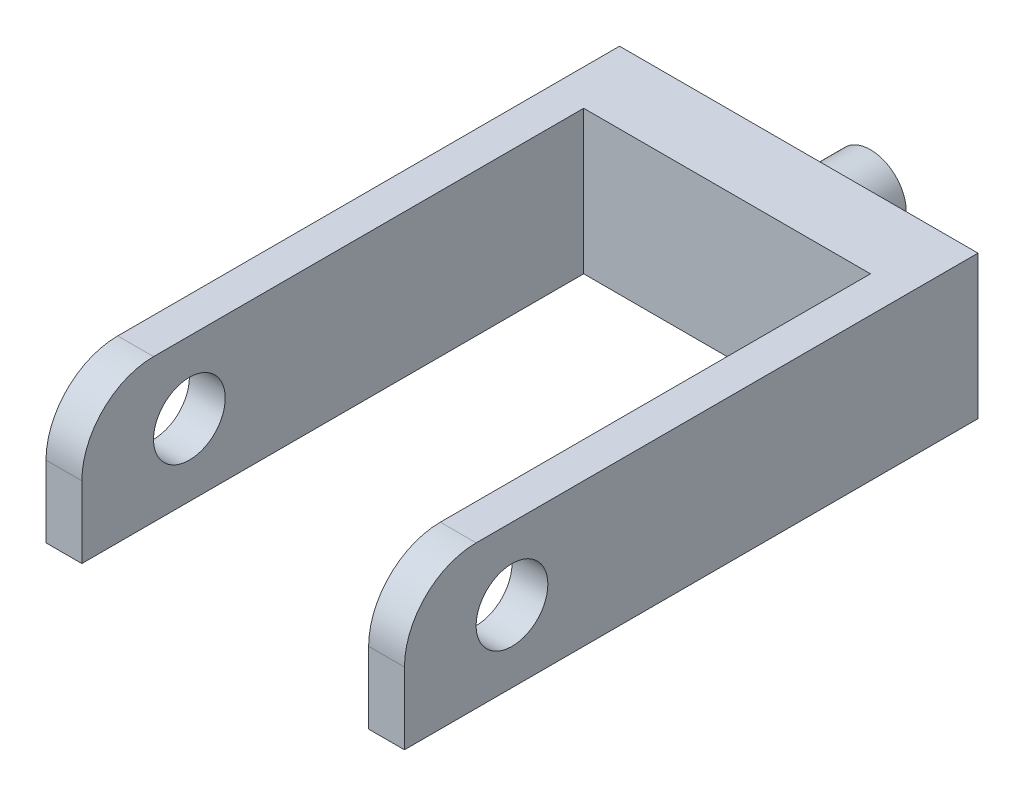
ISO-10303-21;
HEADER;
FILE_DESCRIPTION(('STEP AP214'),'2;1');
FILE_NAME('part.step','',(''),(''),'','','');
FILE_SCHEMA(('AUTOMOTIVE_DESIGN { 1 0 10303 214 1 1 1 1 }'));
ENDSEC;
DATA;
#1=APPLICATION_CONTEXT('core data for automotive mechanical design processes');
#2=APPLICATION_PROTOCOL_DEFINITION('international standard','automotive_design',2000,#1);
#3=PRODUCT_CONTEXT('',#1,'mechanical');
#4=PRODUCT('Part','Part','',(#3));
#5=PRODUCT_RELATED_PRODUCT_CATEGORY('part','',(#4));
#6=PRODUCT_DEFINITION_FORMATION('','',#4);
#7=PRODUCT_DEFINITION_CONTEXT('part definition',#1,'design');
#8=PRODUCT_DEFINITION('design','',#6,#7);
#9=PRODUCT_DEFINITION_SHAPE('','',#8);
#10=(LENGTH_UNIT() NAMED_UNIT(*) SI_UNIT(.MILLI.,.METRE.));
#11=(NAMED_UNIT(*) PLANE_ANGLE_UNIT() SI_UNIT($,.RADIAN.));
#12=(NAMED_UNIT(*) SI_UNIT($,.STERADIAN.) SOLID_ANGLE_UNIT());
#13=UNCERTAINTY_MEASURE_WITH_UNIT(LENGTH_MEASURE(1.E-05),#10,'distance_accuracy_value','');
#14=(GEOMETRIC_REPRESENTATION_CONTEXT(3) GLOBAL_UNCERTAINTY_ASSIGNED_CONTEXT((#13)) GLOBAL_UNIT_ASSIGNED_CONTEXT((#10,
#11,#12)) REPRESENTATION_CONTEXT('',''));
#15=CARTESIAN_POINT('',(0.,0.,0.));
#16=DIRECTION('',(0.,0.,1.));
#17=DIRECTION('',(1.,0.,0.));
#18=AXIS2_PLACEMENT_3D('',#15,#16,#17);
#19=CARTESIAN_POINT('',(0.,50.8,203.2));
#20=DIRECTION('',(0.,0.,-1.));
#21=DIRECTION('',(-1.,0.,0.));
#22=AXIS2_PLACEMENT_3D('',#19,#20,#21);
#23=PLANE('',#22);
#24=DIRECTION('',(0.,-1.,0.));
#25=VECTOR('',#24,1.);
#26=CARTESIAN_POINT('',(0.,50.8,203.2));
#27=LINE('',#26,#25);
#28=CARTESIAN_POINT('',(0.,25.4,203.2));
#29=VERTEX_POINT('',#28);
#30=CARTESIAN_POINT('',(0.,0.,203.2));
#31=VERTEX_POINT('',#30);
#32=EDGE_CURVE('E159',#29,#31,#27,.T.);
#33=ORIENTED_EDGE('',*,*,#32,.F.);
#34=DIRECTION('',(1.,0.,0.));
#35=VECTOR('',#34,1.);
#36=CARTESIAN_POINT('',(0.,25.4,203.2));
#37=LINE('',#36,#35);
#38=CARTESIAN_POINT('',(-12.7,25.4,203.2));
#39=VERTEX_POINT('',#38);
#40=EDGE_CURVE('E44',#29,#39,#37,.F.);
#41=ORIENTED_EDGE('',*,*,#40,.T.);
#42=DIRECTION('',(0.,1.,0.));
#43=VECTOR('',#42,1.);
#44=CARTESIAN_POINT('',(-12.7,-203.2,203.2));
#45=LINE('',#44,#43);
#46=CARTESIAN_POINT('',(-12.7,0.,203.2));
#47=VERTEX_POINT('',#46);
#48=EDGE_CURVE('E148',#47,#39,#45,.T.);
#49=ORIENTED_EDGE('',*,*,#48,.F.);
#50=DIRECTION('',(1.,0.,0.));
#51=VECTOR('',#50,1.);
#52=CARTESIAN_POINT('',(0.,0.,203.2));
#53=LINE('',#52,#51);
#54=EDGE_CURVE('E167',#47,#31,#53,.T.);
#55=ORIENTED_EDGE('',*,*,#54,.T.);
#56=EDGE_LOOP('',(#33,#41,#49,#55));
#57=FACE_BOUND('',#56,.T.);
#58=ADVANCED_FACE('F36',(#57),#23,.F.);
#59=CARTESIAN_POINT('',(0.,50.8,0.));
#60=DIRECTION('',(-1.,0.,0.));
#61=DIRECTION('',(0.,0.,1.));
#62=AXIS2_PLACEMENT_3D('',#59,#60,#61);
#63=PLANE('',#62);
#64=CARTESIAN_POINT('',(0.,25.4,165.1));
#65=DIRECTION('',(1.,0.,0.));
#66=DIRECTION('',(0.,0.,-1.));
#67=AXIS2_PLACEMENT_3D('',#64,#65,#66);
#68=CIRCLE('',#67,12.7);
#69=CARTESIAN_POINT('',(0.,25.4,152.4));
#70=VERTEX_POINT('',#69);
#71=EDGE_CURVE('E188',#70,#70,#68,.T.);
#72=ORIENTED_EDGE('',*,*,#71,.F.);
#73=EDGE_LOOP('',(#72));
#74=FACE_BOUND('',#73,.T.);
#75=DIRECTION('',(0.,0.,-1.));
#76=VECTOR('',#75,1.);
#77=CARTESIAN_POINT('',(0.,50.8,0.));
#78=LINE('',#77,#76);
#79=CARTESIAN_POINT('',(0.,50.8,177.8));
#80=VERTEX_POINT('',#79);
#81=CARTESIAN_POINT('',(0.,50.8,0.));
#82=VERTEX_POINT('',#81);
#83=EDGE_CURVE('E152',#80,#82,#78,.T.);
#84=ORIENTED_EDGE('',*,*,#83,.F.);
#85=CARTESIAN_POINT('',(0.,25.4,177.8));
#86=DIRECTION('',(-1.,0.,0.));
#87=DIRECTION('',(0.,0.,1.));
#88=AXIS2_PLACEMENT_3D('',#85,#86,#87);
#89=CIRCLE('',#88,25.4);
#90=EDGE_CURVE('E58',#80,#29,#89,.F.);
#91=ORIENTED_EDGE('',*,*,#90,.T.);
#92=ORIENTED_EDGE('',*,*,#32,.T.);
#93=DIRECTION('',(0.,0.,-1.));
#94=VECTOR('',#93,1.);
#95=CARTESIAN_POINT('',(0.,0.,0.));
#96=LINE('',#95,#94);
#97=CARTESIAN_POINT('',(0.,0.,0.));
#98=VERTEX_POINT('',#97);
#99=EDGE_CURVE('E147',#31,#98,#96,.T.);
#100=ORIENTED_EDGE('',*,*,#99,.T.);
#101=DIRECTION('',(0.,-1.,0.));
#102=VECTOR('',#101,1.);
#103=CARTESIAN_POINT('',(0.,50.8,0.));
#104=LINE('',#103,#102);
#105=EDGE_CURVE('E176',#82,#98,#104,.T.);
#106=ORIENTED_EDGE('',*,*,#105,.F.);
#107=EDGE_LOOP('',(#84,#91,#92,#100,#106));
#108=FACE_BOUND('',#107,.T.);
#109=ADVANCED_FACE('F204',(#74,#108),#63,.F.);
#110=CARTESIAN_POINT('',(0.,50.8,0.));
#111=DIRECTION('',(0.,0.,1.));
#112=DIRECTION('',(1.,0.,0.));
#113=AXIS2_PLACEMENT_3D('',#110,#111,#112);
#114=PLANE('',#113);
#115=CARTESIAN_POINT('',(-63.5,25.4,0.));
#116=DIRECTION('',(0.,0.,-1.));
#117=DIRECTION('',(-1.,0.,0.));
#118=AXIS2_PLACEMENT_3D('',#115,#116,#117);
#119=CIRCLE('',#118,12.7);
#120=CARTESIAN_POINT('',(-76.2,25.4,0.));
#121=VERTEX_POINT('',#120);
#122=EDGE_CURVE('E184',#121,#121,#119,.T.);
#123=ORIENTED_EDGE('',*,*,#122,.F.);
#124=EDGE_LOOP('',(#123));
#125=FACE_BOUND('',#124,.T.);
#126=DIRECTION('',(-1.,0.,0.));
#127=VECTOR('',#126,1.);
#128=CARTESIAN_POINT('',(0.,0.,0.));
#129=LINE('',#128,#127);
#130=CARTESIAN_POINT('',(-127.,0.,0.));
#131=VERTEX_POINT('',#130);
#132=EDGE_CURVE('E162',#98,#131,#129,.T.);
#133=ORIENTED_EDGE('',*,*,#132,.T.);
#134=DIRECTION('',(0.,-1.,0.));
#135=VECTOR('',#134,1.);
#136=CARTESIAN_POINT('',(-127.,50.8,0.));
#137=LINE('',#136,#135);
#138=CARTESIAN_POINT('',(-127.,50.8,0.));
#139=VERTEX_POINT('',#138);
#140=EDGE_CURVE('E173',#139,#131,#137,.T.);
#141=ORIENTED_EDGE('',*,*,#140,.F.);
#142=DIRECTION('',(-1.,0.,0.));
#143=VECTOR('',#142,1.);
#144=CARTESIAN_POINT('',(0.,50.8,0.));
#145=LINE('',#144,#143);
#146=EDGE_CURVE('E154',#82,#139,#145,.T.);
#147=ORIENTED_EDGE('',*,*,#146,.F.);
#148=ORIENTED_EDGE('',*,*,#105,.T.);
#149=EDGE_LOOP('',(#133,#141,#147,#148));
#150=FACE_BOUND('',#149,.T.);
#151=ADVANCED_FACE('F207',(#125,#150),#114,.F.);
#152=CARTESIAN_POINT('',(-127.,50.8,0.));
#153=DIRECTION('',(1.,0.,0.));
#154=DIRECTION('',(0.,0.,-1.));
#155=AXIS2_PLACEMENT_3D('',#152,#153,#154);
#156=PLANE('',#155);
#157=CARTESIAN_POINT('',(-127.,25.4,165.1));
#158=DIRECTION('',(1.,0.,0.));
#159=DIRECTION('',(0.,0.,-1.));
#160=AXIS2_PLACEMENT_3D('',#157,#158,#159);
#161=CIRCLE('',#160,12.7);
#162=CARTESIAN_POINT('',(-127.,25.4,152.4));
#163=VERTEX_POINT('',#162);
#164=EDGE_CURVE('E138',#163,#163,#161,.T.);
#165=ORIENTED_EDGE('',*,*,#164,.T.);
#166=EDGE_LOOP('',(#165));
#167=FACE_BOUND('',#166,.T.);
#168=DIRECTION('',(0.,-1.,0.));
#169=VECTOR('',#168,1.);
#170=CARTESIAN_POINT('',(-127.,50.8,203.2));
#171=LINE('',#170,#169);
#172=CARTESIAN_POINT('',(-127.,25.4,203.2));
#173=VERTEX_POINT('',#172);
#174=CARTESIAN_POINT('',(-127.,0.,203.2));
#175=VERTEX_POINT('',#174);
#176=EDGE_CURVE('E171',#173,#175,#171,.T.);
#177=ORIENTED_EDGE('',*,*,#176,.F.);
#178=CARTESIAN_POINT('',(-127.,25.4,177.8));
#179=DIRECTION('',(1.,0.,0.));
#180=DIRECTION('',(0.,0.,-1.));
#181=AXIS2_PLACEMENT_3D('',#178,#179,#180);
#182=CIRCLE('',#181,25.4);
#183=CARTESIAN_POINT('',(-127.,50.8,177.8));
#184=VERTEX_POINT('',#183);
#185=EDGE_CURVE('E194',#173,#184,#182,.F.);
#186=ORIENTED_EDGE('',*,*,#185,.T.);
#187=DIRECTION('',(0.,0.,1.));
#188=VECTOR('',#187,1.);
#189=CARTESIAN_POINT('',(-127.,50.8,0.));
#190=LINE('',#189,#188);
#191=EDGE_CURVE('E157',#139,#184,#190,.T.);
#192=ORIENTED_EDGE('',*,*,#191,.F.);
#193=ORIENTED_EDGE('',*,*,#140,.T.);
#194=DIRECTION('',(0.,0.,1.));
#195=VECTOR('',#194,1.);
#196=CARTESIAN_POINT('',(-127.,0.,0.));
#197=LINE('',#196,#195);
#198=EDGE_CURVE('E164',#131,#175,#197,.T.);
#199=ORIENTED_EDGE('',*,*,#198,.T.);
#200=EDGE_LOOP('',(#177,#186,#192,#193,#199));
#201=FACE_BOUND('',#200,.T.);
#202=ADVANCED_FACE('F241',(#167,#201),#156,.F.);
#203=DIRECTION('',(0.,1.,0.));
#204=VECTOR('',#203,1.);
#205=CARTESIAN_POINT('',(-114.3,-203.2,203.2));
#206=LINE('',#205,#204);
#207=CARTESIAN_POINT('',(-114.3,0.,203.2));
#208=VERTEX_POINT('',#207);
#209=CARTESIAN_POINT('',(-114.3,25.4,203.2));
#210=VERTEX_POINT('',#209);
#211=EDGE_CURVE('E121',#208,#210,#206,.T.);
#212=ORIENTED_EDGE('',*,*,#211,.T.);
#213=DIRECTION('',(1.,0.,0.));
#214=VECTOR('',#213,1.);
#215=CARTESIAN_POINT('',(0.,25.4,203.2));
#216=LINE('',#215,#214);
#217=EDGE_CURVE('E192',#210,#173,#216,.F.);
#218=ORIENTED_EDGE('',*,*,#217,.T.);
#219=ORIENTED_EDGE('',*,*,#176,.T.);
#220=EDGE_CURVE('E155',#175,#208,#53,.T.);
#221=ORIENTED_EDGE('',*,*,#220,.T.);
#222=EDGE_LOOP('',(#212,#218,#219,#221));
#223=FACE_BOUND('',#222,.T.);
#224=ADVANCED_FACE('F216',(#223),#23,.F.);
#225=CARTESIAN_POINT('',(0.,50.8,0.));
#226=DIRECTION('',(0.,-1.,0.));
#227=DIRECTION('',(0.,0.,-1.));
#228=AXIS2_PLACEMENT_3D('',#225,#226,#227);
#229=PLANE('',#228);
#230=DIRECTION('',(0.,0.,-1.));
#231=VECTOR('',#230,1.);
#232=CARTESIAN_POINT('',(-12.7,50.8,25.4));
#233=LINE('',#232,#231);
#234=CARTESIAN_POINT('',(-12.7,50.8,177.8));
#235=VERTEX_POINT('',#234);
#236=CARTESIAN_POINT('',(-12.7,50.8,25.4));
#237=VERTEX_POINT('',#236);
#238=EDGE_CURVE('E131',#235,#237,#233,.T.);
#239=ORIENTED_EDGE('',*,*,#238,.F.);
#240=DIRECTION('',(1.,0.,0.));
#241=VECTOR('',#240,1.);
#242=CARTESIAN_POINT('',(0.,50.8,177.8));
#243=LINE('',#242,#241);
#244=EDGE_CURVE('E196',#235,#80,#243,.T.);
#245=ORIENTED_EDGE('',*,*,#244,.T.);
#246=ORIENTED_EDGE('',*,*,#83,.T.);
#247=ORIENTED_EDGE('',*,*,#146,.T.);
#248=ORIENTED_EDGE('',*,*,#191,.T.);
#249=DIRECTION('',(1.,0.,0.));
#250=VECTOR('',#249,1.);
#251=CARTESIAN_POINT('',(0.,50.8,177.8));
#252=LINE('',#251,#250);
#253=CARTESIAN_POINT('',(-114.3,50.8,177.8));
#254=VERTEX_POINT('',#253);
#255=EDGE_CURVE('E137',#184,#254,#252,.T.);
#256=ORIENTED_EDGE('',*,*,#255,.T.);
#257=DIRECTION('',(0.,0.,1.));
#258=VECTOR('',#257,1.);
#259=CARTESIAN_POINT('',(-114.3,50.8,25.4));
#260=LINE('',#259,#258);
#261=CARTESIAN_POINT('',(-114.3,50.8,25.4));
#262=VERTEX_POINT('',#261);
#263=EDGE_CURVE('E116',#262,#254,#260,.T.);
#264=ORIENTED_EDGE('',*,*,#263,.F.);
#265=DIRECTION('',(-1.,0.,0.));
#266=VECTOR('',#265,1.);
#267=CARTESIAN_POINT('',(-63.5,50.8,25.4));
#268=LINE('',#267,#266);
#269=EDGE_CURVE('E122',#237,#262,#268,.T.);
#270=ORIENTED_EDGE('',*,*,#269,.F.);
#271=EDGE_LOOP('',(#239,#245,#246,#247,#248,#256,#264,#270));
#272=FACE_BOUND('',#271,.T.);
#273=ADVANCED_FACE('F134',(#272),#229,.F.);
#274=CARTESIAN_POINT('',(0.,0.,0.));
#275=DIRECTION('',(0.,-1.,0.));
#276=DIRECTION('',(0.,0.,-1.));
#277=AXIS2_PLACEMENT_3D('',#274,#275,#276);
#278=PLANE('',#277);
#279=DIRECTION('',(0.,0.,1.));
#280=VECTOR('',#279,1.);
#281=CARTESIAN_POINT('',(-12.7,0.,0.));
#282=LINE('',#281,#280);
#283=CARTESIAN_POINT('',(-12.7,0.,25.4));
#284=VERTEX_POINT('',#283);
#285=EDGE_CURVE('E182',#284,#47,#282,.T.);
#286=ORIENTED_EDGE('',*,*,#285,.F.);
#287=DIRECTION('',(1.,0.,0.));
#288=VECTOR('',#287,1.);
#289=CARTESIAN_POINT('',(0.,0.,25.4));
#290=LINE('',#289,#288);
#291=CARTESIAN_POINT('',(-114.3,0.,25.4));
#292=VERTEX_POINT('',#291);
#293=EDGE_CURVE('E180',#292,#284,#290,.T.);
#294=ORIENTED_EDGE('',*,*,#293,.F.);
#295=DIRECTION('',(0.,0.,-1.));
#296=VECTOR('',#295,1.);
#297=CARTESIAN_POINT('',(-114.3,0.,0.));
#298=LINE('',#297,#296);
#299=EDGE_CURVE('E118',#208,#292,#298,.T.);
#300=ORIENTED_EDGE('',*,*,#299,.F.);
#301=ORIENTED_EDGE('',*,*,#220,.F.);
#302=ORIENTED_EDGE('',*,*,#198,.F.);
#303=ORIENTED_EDGE('',*,*,#132,.F.);
#304=ORIENTED_EDGE('',*,*,#99,.F.);
#305=ORIENTED_EDGE('',*,*,#54,.F.);
#306=EDGE_LOOP('',(#286,#294,#300,#301,#302,#303,#304,#305));
#307=FACE_BOUND('',#306,.T.);
#308=ADVANCED_FACE('F222',(#307),#278,.T.);
#309=CARTESIAN_POINT('',(-63.5,-203.2,25.4));
#310=DIRECTION('',(0.,0.,-1.));
#311=DIRECTION('',(-1.,0.,0.));
#312=AXIS2_PLACEMENT_3D('',#309,#310,#311);
#313=PLANE('',#312);
#314=ORIENTED_EDGE('',*,*,#293,.T.);
#315=DIRECTION('',(0.,1.,0.));
#316=VECTOR('',#315,1.);
#317=CARTESIAN_POINT('',(-12.7,-203.2,25.4));
#318=LINE('',#317,#316);
#319=EDGE_CURVE('E128',#284,#237,#318,.T.);
#320=ORIENTED_EDGE('',*,*,#319,.T.);
#321=ORIENTED_EDGE('',*,*,#269,.T.);
#322=DIRECTION('',(0.,1.,0.));
#323=VECTOR('',#322,1.);
#324=CARTESIAN_POINT('',(-114.3,-203.2,25.4));
#325=LINE('',#324,#323);
#326=EDGE_CURVE('E112',#292,#262,#325,.T.);
#327=ORIENTED_EDGE('',*,*,#326,.F.);
#328=EDGE_LOOP('',(#314,#320,#321,#327));
#329=FACE_BOUND('',#328,.T.);
#330=ADVANCED_FACE('F126',(#329),#313,.F.);
#331=CARTESIAN_POINT('',(-12.7,-203.2,25.4));
#332=DIRECTION('',(1.,0.,0.));
#333=DIRECTION('',(0.,0.,-1.));
#334=AXIS2_PLACEMENT_3D('',#331,#332,#333);
#335=PLANE('',#334);
#336=CARTESIAN_POINT('',(-12.7,25.4,165.1));
#337=DIRECTION('',(1.,0.,0.));
#338=DIRECTION('',(0.,0.,-1.));
#339=AXIS2_PLACEMENT_3D('',#336,#337,#338);
#340=CIRCLE('',#339,12.7);
#341=CARTESIAN_POINT('',(-12.7,25.4,152.4));
#342=VERTEX_POINT('',#341);
#343=EDGE_CURVE('E142',#342,#342,#340,.T.);
#344=ORIENTED_EDGE('',*,*,#343,.T.);
#345=EDGE_LOOP('',(#344));
#346=FACE_BOUND('',#345,.T.);
#347=ORIENTED_EDGE('',*,*,#48,.T.);
#348=CARTESIAN_POINT('',(-12.7,25.4,177.8));
#349=DIRECTION('',(1.,0.,0.));
#350=DIRECTION('',(0.,0.,-1.));
#351=AXIS2_PLACEMENT_3D('',#348,#349,#350);
#352=CIRCLE('',#351,25.4);
#353=EDGE_CURVE('E11',#39,#235,#352,.F.);
#354=ORIENTED_EDGE('',*,*,#353,.T.);
#355=ORIENTED_EDGE('',*,*,#238,.T.);
#356=ORIENTED_EDGE('',*,*,#319,.F.);
#357=ORIENTED_EDGE('',*,*,#285,.T.);
#358=EDGE_LOOP('',(#347,#354,#355,#356,#357));
#359=FACE_BOUND('',#358,.T.);
#360=ADVANCED_FACE('F225',(#346,#359),#335,.F.);
#361=CARTESIAN_POINT('',(-114.3,-203.2,25.4));
#362=DIRECTION('',(-1.,0.,0.));
#363=DIRECTION('',(0.,0.,1.));
#364=AXIS2_PLACEMENT_3D('',#361,#362,#363);
#365=PLANE('',#364);
#366=CARTESIAN_POINT('',(-114.3,25.4,165.1));
#367=DIRECTION('',(-1.,0.,0.));
#368=DIRECTION('',(0.,0.,1.));
#369=AXIS2_PLACEMENT_3D('',#366,#367,#368);
#370=CIRCLE('',#369,12.7);
#371=CARTESIAN_POINT('',(-114.3,25.4,177.8));
#372=VERTEX_POINT('',#371);
#373=EDGE_CURVE('E185',#372,#372,#370,.T.);
#374=ORIENTED_EDGE('',*,*,#373,.T.);
#375=EDGE_LOOP('',(#374));
#376=FACE_BOUND('',#375,.T.);
#377=ORIENTED_EDGE('',*,*,#263,.T.);
#378=CARTESIAN_POINT('',(-114.3,25.4,177.8));
#379=DIRECTION('',(-1.,0.,0.));
#380=DIRECTION('',(0.,0.,1.));
#381=AXIS2_PLACEMENT_3D('',#378,#379,#380);
#382=CIRCLE('',#381,25.4);
#383=EDGE_CURVE('E190',#254,#210,#382,.F.);
#384=ORIENTED_EDGE('',*,*,#383,.T.);
#385=ORIENTED_EDGE('',*,*,#211,.F.);
#386=ORIENTED_EDGE('',*,*,#299,.T.);
#387=ORIENTED_EDGE('',*,*,#326,.T.);
#388=EDGE_LOOP('',(#377,#384,#385,#386,#387));
#389=FACE_BOUND('',#388,.T.);
#390=ADVANCED_FACE('F114',(#376,#389),#365,.F.);
#391=CARTESIAN_POINT('',(-254.,25.4,165.1));
#392=DIRECTION('',(1.,0.,0.));
#393=DIRECTION('',(0.,0.,-1.));
#394=AXIS2_PLACEMENT_3D('',#391,#392,#393);
#395=CYLINDRICAL_SURFACE('',#394,12.7);
#396=ORIENTED_EDGE('',*,*,#373,.F.);
#397=EDGE_LOOP('',(#396));
#398=FACE_BOUND('',#397,.T.);
#399=ORIENTED_EDGE('',*,*,#164,.F.);
#400=EDGE_LOOP('',(#399));
#401=FACE_BOUND('',#400,.T.);
#402=ADVANCED_FACE('F255',(#398,#401),#395,.F.);
#403=ORIENTED_EDGE('',*,*,#71,.T.);
#404=EDGE_LOOP('',(#403));
#405=FACE_BOUND('',#404,.T.);
#406=ORIENTED_EDGE('',*,*,#343,.F.);
#407=EDGE_LOOP('',(#406));
#408=FACE_BOUND('',#407,.T.);
#409=ADVANCED_FACE('F257',(#405,#408),#395,.F.);
#410=CARTESIAN_POINT('',(-63.5,25.4,-25.4));
#411=DIRECTION('',(0.,0.,1.));
#412=DIRECTION('',(1.,0.,0.));
#413=AXIS2_PLACEMENT_3D('',#410,#411,#412);
#414=CYLINDRICAL_SURFACE('',#413,12.7);
#415=CARTESIAN_POINT('',(-63.5,25.4,-25.4));
#416=DIRECTION('',(0.,0.,-1.));
#417=DIRECTION('',(-1.,0.,0.));
#418=AXIS2_PLACEMENT_3D('',#415,#416,#417);
#419=CIRCLE('',#418,12.7);
#420=CARTESIAN_POINT('',(-76.2,25.4,-25.4));
#421=VERTEX_POINT('',#420);
#422=EDGE_CURVE('E357',#421,#421,#419,.T.);
#423=ORIENTED_EDGE('',*,*,#422,.F.);
#424=EDGE_LOOP('',(#423));
#425=FACE_BOUND('',#424,.T.);
#426=ORIENTED_EDGE('',*,*,#122,.T.);
#427=EDGE_LOOP('',(#426));
#428=FACE_BOUND('',#427,.T.);
#429=ADVANCED_FACE('F264',(#425,#428),#414,.T.);
#430=CARTESIAN_POINT('',(-63.5,25.4,-25.4));
#431=DIRECTION('',(0.,0.,-1.));
#432=DIRECTION('',(-1.,0.,0.));
#433=AXIS2_PLACEMENT_3D('',#430,#431,#432);
#434=PLANE('',#433);
#435=ORIENTED_EDGE('',*,*,#422,.T.);
#436=EDGE_LOOP('',(#435));
#437=FACE_BOUND('',#436,.T.);
#438=ADVANCED_FACE('F230',(#437),#434,.T.);
#439=CARTESIAN_POINT('',(0.,25.4,177.8));
#440=DIRECTION('',(1.,0.,0.));
#441=DIRECTION('',(0.,0.,-1.));
#442=AXIS2_PLACEMENT_3D('',#439,#440,#441);
#443=CYLINDRICAL_SURFACE('',#442,25.4);
#444=ORIENTED_EDGE('',*,*,#185,.F.);
#445=ORIENTED_EDGE('',*,*,#217,.F.);
#446=ORIENTED_EDGE('',*,*,#383,.F.);
#447=ORIENTED_EDGE('',*,*,#255,.F.);
#448=EDGE_LOOP('',(#444,#445,#446,#447));
#449=FACE_BOUND('',#448,.T.);
#450=ADVANCED_FACE('F213',(#449),#443,.T.);
#451=CARTESIAN_POINT('',(0.,25.4,177.8));
#452=DIRECTION('',(1.,0.,0.));
#453=DIRECTION('',(0.,0.,-1.));
#454=AXIS2_PLACEMENT_3D('',#451,#452,#453);
#455=CYLINDRICAL_SURFACE('',#454,25.4);
#456=ORIENTED_EDGE('',*,*,#353,.F.);
#457=ORIENTED_EDGE('',*,*,#40,.F.);
#458=ORIENTED_EDGE('',*,*,#90,.F.);
#459=ORIENTED_EDGE('',*,*,#244,.F.);
#460=EDGE_LOOP('',(#456,#457,#458,#459));
#461=FACE_BOUND('',#460,.T.);
#462=ADVANCED_FACE('F38',(#461),#455,.T.);
#463=CLOSED_SHELL('',(#58,#109,#151,#202,#224,#273,#308,#330,#360,#390,#402,#409,#429,#438,#450,#462));
#464=MANIFOLD_SOLID_BREP('B2',#463);
#465=ADVANCED_BREP_SHAPE_REPRESENTATION('',(#18,#464),#14);
#466=SHAPE_DEFINITION_REPRESENTATION(#9,#465);
ENDSEC;
END-ISO-10303-21;
